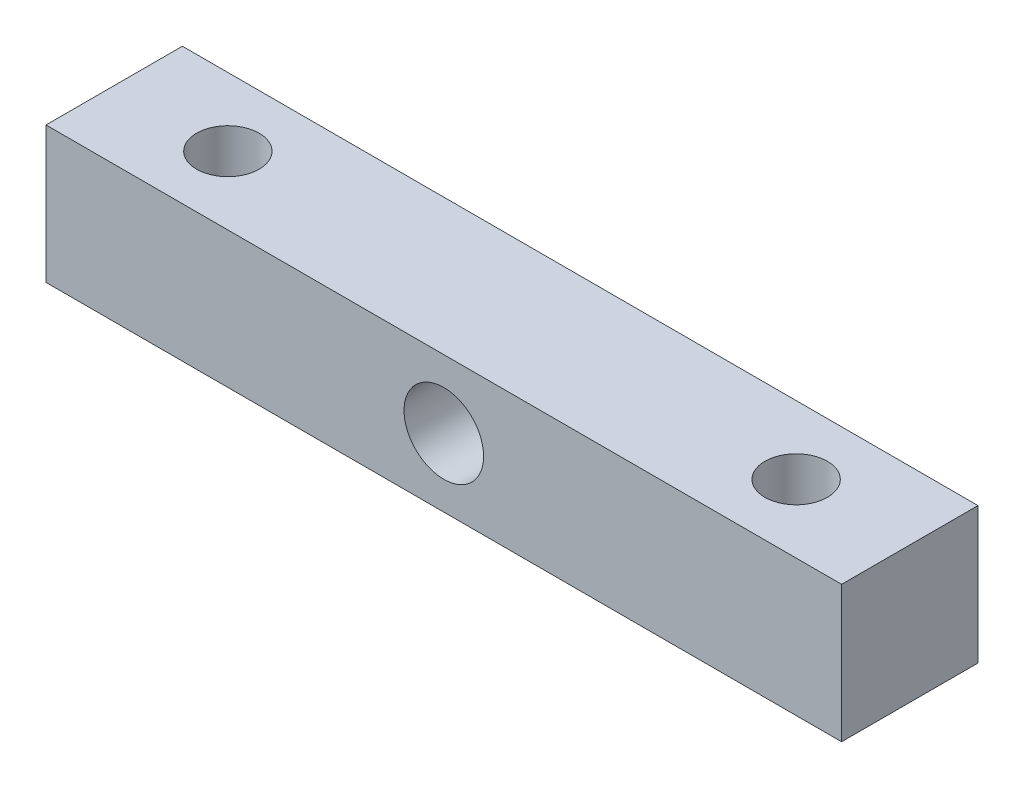
ISO-10303-21;
HEADER;
FILE_DESCRIPTION(('STEP AP214'),'2;1');
FILE_NAME('part.step','',(''),(''),'','','');
FILE_SCHEMA(('AUTOMOTIVE_DESIGN { 1 0 10303 214 1 1 1 1 }'));
ENDSEC;
DATA;
#1=APPLICATION_CONTEXT('core data for automotive mechanical design processes');
#2=APPLICATION_PROTOCOL_DEFINITION('international standard','automotive_design',2000,#1);
#3=PRODUCT_CONTEXT('',#1,'mechanical');
#4=PRODUCT('Part','Part','',(#3));
#5=PRODUCT_RELATED_PRODUCT_CATEGORY('part','',(#4));
#6=PRODUCT_DEFINITION_FORMATION('','',#4);
#7=PRODUCT_DEFINITION_CONTEXT('part definition',#1,'design');
#8=PRODUCT_DEFINITION('design','',#6,#7);
#9=PRODUCT_DEFINITION_SHAPE('','',#8);
#10=(LENGTH_UNIT() NAMED_UNIT(*) SI_UNIT(.MILLI.,.METRE.));
#11=(NAMED_UNIT(*) PLANE_ANGLE_UNIT() SI_UNIT($,.RADIAN.));
#12=(NAMED_UNIT(*) SI_UNIT($,.STERADIAN.) SOLID_ANGLE_UNIT());
#13=UNCERTAINTY_MEASURE_WITH_UNIT(LENGTH_MEASURE(1.E-05),#10,'distance_accuracy_value','');
#14=(GEOMETRIC_REPRESENTATION_CONTEXT(3) GLOBAL_UNCERTAINTY_ASSIGNED_CONTEXT((#13)) GLOBAL_UNIT_ASSIGNED_CONTEXT((#10,
#11,#12)) REPRESENTATION_CONTEXT('',''));
#15=CARTESIAN_POINT('',(0.,0.,0.));
#16=DIRECTION('',(0.,0.,1.));
#17=DIRECTION('',(1.,0.,0.));
#18=AXIS2_PLACEMENT_3D('',#15,#16,#17);
#19=CARTESIAN_POINT('',(0.,12.,0.));
#20=DIRECTION('',(0.,0.,-1.));
#21=DIRECTION('',(-1.,0.,0.));
#22=AXIS2_PLACEMENT_3D('',#19,#20,#21);
#23=PLANE('',#22);
#24=CARTESIAN_POINT('',(35.,6.,0.));
#25=DIRECTION('',(0.,0.,1.));
#26=DIRECTION('',(1.,0.,0.));
#27=AXIS2_PLACEMENT_3D('',#24,#25,#26);
#28=CIRCLE('',#27,3.49999999999999);
#29=CARTESIAN_POINT('',(38.5,6.,0.));
#30=VERTEX_POINT('',#29);
#31=EDGE_CURVE('E114',#30,#30,#28,.T.);
#32=ORIENTED_EDGE('',*,*,#31,.F.);
#33=EDGE_LOOP('',(#32));
#34=FACE_BOUND('',#33,.T.);
#35=DIRECTION('',(1.,0.,0.));
#36=VECTOR('',#35,1.);
#37=CARTESIAN_POINT('',(0.,0.,0.));
#38=LINE('',#37,#36);
#39=CARTESIAN_POINT('',(0.,0.,0.));
#40=VERTEX_POINT('',#39);
#41=CARTESIAN_POINT('',(70.,0.,0.));
#42=VERTEX_POINT('',#41);
#43=EDGE_CURVE('E98',#40,#42,#38,.T.);
#44=ORIENTED_EDGE('',*,*,#43,.T.);
#45=DIRECTION('',(0.,-1.,0.));
#46=VECTOR('',#45,1.);
#47=CARTESIAN_POINT('',(70.,12.,0.));
#48=LINE('',#47,#46);
#49=CARTESIAN_POINT('',(70.,12.,0.));
#50=VERTEX_POINT('',#49);
#51=EDGE_CURVE('E11',#50,#42,#48,.T.);
#52=ORIENTED_EDGE('',*,*,#51,.F.);
#53=DIRECTION('',(1.,0.,0.));
#54=VECTOR('',#53,1.);
#55=CARTESIAN_POINT('',(0.,12.,0.));
#56=LINE('',#55,#54);
#57=CARTESIAN_POINT('',(0.,12.,0.));
#58=VERTEX_POINT('',#57);
#59=EDGE_CURVE('E86',#58,#50,#56,.T.);
#60=ORIENTED_EDGE('',*,*,#59,.F.);
#61=DIRECTION('',(0.,-1.,0.));
#62=VECTOR('',#61,1.);
#63=CARTESIAN_POINT('',(0.,12.,0.));
#64=LINE('',#63,#62);
#65=EDGE_CURVE('E94',#58,#40,#64,.T.);
#66=ORIENTED_EDGE('',*,*,#65,.T.);
#67=EDGE_LOOP('',(#44,#52,#60,#66));
#68=FACE_BOUND('',#67,.T.);
#69=ADVANCED_FACE('F35',(#34,#68),#23,.F.);
#70=CARTESIAN_POINT('',(70.,12.,0.));
#71=DIRECTION('',(-1.,0.,0.));
#72=DIRECTION('',(0.,0.,1.));
#73=AXIS2_PLACEMENT_3D('',#70,#71,#72);
#74=PLANE('',#73);
#75=DIRECTION('',(0.,0.,-1.));
#76=VECTOR('',#75,1.);
#77=CARTESIAN_POINT('',(70.,0.,0.));
#78=LINE('',#77,#76);
#79=CARTESIAN_POINT('',(70.,0.,-12.));
#80=VERTEX_POINT('',#79);
#81=EDGE_CURVE('E90',#42,#80,#78,.T.);
#82=ORIENTED_EDGE('',*,*,#81,.T.);
#83=DIRECTION('',(0.,-1.,0.));
#84=VECTOR('',#83,1.);
#85=CARTESIAN_POINT('',(70.,12.,-12.));
#86=LINE('',#85,#84);
#87=CARTESIAN_POINT('',(70.,12.,-12.));
#88=VERTEX_POINT('',#87);
#89=EDGE_CURVE('E43',#88,#80,#86,.T.);
#90=ORIENTED_EDGE('',*,*,#89,.F.);
#91=DIRECTION('',(0.,0.,-1.));
#92=VECTOR('',#91,1.);
#93=CARTESIAN_POINT('',(70.,12.,0.));
#94=LINE('',#93,#92);
#95=EDGE_CURVE('E81',#50,#88,#94,.T.);
#96=ORIENTED_EDGE('',*,*,#95,.F.);
#97=ORIENTED_EDGE('',*,*,#51,.T.);
#98=EDGE_LOOP('',(#82,#90,#96,#97));
#99=FACE_BOUND('',#98,.T.);
#100=ADVANCED_FACE('F89',(#99),#74,.F.);
#101=CARTESIAN_POINT('',(0.,12.,-12.));
#102=DIRECTION('',(0.,0.,1.));
#103=DIRECTION('',(1.,0.,0.));
#104=AXIS2_PLACEMENT_3D('',#101,#102,#103);
#105=PLANE('',#104);
#106=CARTESIAN_POINT('',(35.,6.,-12.));
#107=DIRECTION('',(0.,0.,1.));
#108=DIRECTION('',(1.,0.,0.));
#109=AXIS2_PLACEMENT_3D('',#106,#107,#108);
#110=CIRCLE('',#109,3.5);
#111=CARTESIAN_POINT('',(38.5,6.,-12.));
#112=VERTEX_POINT('',#111);
#113=EDGE_CURVE('E101',#112,#112,#110,.T.);
#114=ORIENTED_EDGE('',*,*,#113,.T.);
#115=EDGE_LOOP('',(#114));
#116=FACE_BOUND('',#115,.T.);
#117=DIRECTION('',(-1.,0.,0.));
#118=VECTOR('',#117,1.);
#119=CARTESIAN_POINT('',(0.,0.,-12.));
#120=LINE('',#119,#118);
#121=CARTESIAN_POINT('',(0.,0.,-12.));
#122=VERTEX_POINT('',#121);
#123=EDGE_CURVE('E68',#80,#122,#120,.T.);
#124=ORIENTED_EDGE('',*,*,#123,.T.);
#125=DIRECTION('',(0.,-1.,0.));
#126=VECTOR('',#125,1.);
#127=CARTESIAN_POINT('',(0.,12.,-12.));
#128=LINE('',#127,#126);
#129=CARTESIAN_POINT('',(0.,12.,-12.));
#130=VERTEX_POINT('',#129);
#131=EDGE_CURVE('E91',#130,#122,#128,.T.);
#132=ORIENTED_EDGE('',*,*,#131,.F.);
#133=DIRECTION('',(-1.,0.,0.));
#134=VECTOR('',#133,1.);
#135=CARTESIAN_POINT('',(0.,12.,-12.));
#136=LINE('',#135,#134);
#137=EDGE_CURVE('E84',#88,#130,#136,.T.);
#138=ORIENTED_EDGE('',*,*,#137,.F.);
#139=ORIENTED_EDGE('',*,*,#89,.T.);
#140=EDGE_LOOP('',(#124,#132,#138,#139));
#141=FACE_BOUND('',#140,.T.);
#142=ADVANCED_FACE('F92',(#116,#141),#105,.F.);
#143=CARTESIAN_POINT('',(0.,12.,0.));
#144=DIRECTION('',(1.,0.,0.));
#145=DIRECTION('',(0.,0.,-1.));
#146=AXIS2_PLACEMENT_3D('',#143,#144,#145);
#147=PLANE('',#146);
#148=DIRECTION('',(0.,0.,1.));
#149=VECTOR('',#148,1.);
#150=CARTESIAN_POINT('',(0.,0.,0.));
#151=LINE('',#150,#149);
#152=EDGE_CURVE('E74',#122,#40,#151,.T.);
#153=ORIENTED_EDGE('',*,*,#152,.T.);
#154=ORIENTED_EDGE('',*,*,#65,.F.);
#155=DIRECTION('',(0.,0.,1.));
#156=VECTOR('',#155,1.);
#157=CARTESIAN_POINT('',(0.,12.,0.));
#158=LINE('',#157,#156);
#159=EDGE_CURVE('E51',#130,#58,#158,.T.);
#160=ORIENTED_EDGE('',*,*,#159,.F.);
#161=ORIENTED_EDGE('',*,*,#131,.T.);
#162=EDGE_LOOP('',(#153,#154,#160,#161));
#163=FACE_BOUND('',#162,.T.);
#164=ADVANCED_FACE('F106',(#163),#147,.F.);
#165=CARTESIAN_POINT('',(70.,12.,0.));
#166=DIRECTION('',(0.,1.,0.));
#167=DIRECTION('',(0.,0.,1.));
#168=AXIS2_PLACEMENT_3D('',#165,#166,#167);
#169=PLANE('',#168);
#170=CARTESIAN_POINT('',(10.,12.,-6.));
#171=DIRECTION('',(0.,1.,0.));
#172=DIRECTION('',(0.,0.,1.));
#173=AXIS2_PLACEMENT_3D('',#170,#171,#172);
#174=CIRCLE('',#173,2.74999999999999);
#175=CARTESIAN_POINT('',(10.,12.,-3.25000000000002));
#176=VERTEX_POINT('',#175);
#177=EDGE_CURVE('E126',#176,#176,#174,.T.);
#178=ORIENTED_EDGE('',*,*,#177,.F.);
#179=EDGE_LOOP('',(#178));
#180=FACE_BOUND('',#179,.T.);
#181=CARTESIAN_POINT('',(60.,12.,-6.));
#182=DIRECTION('',(0.,1.,0.));
#183=DIRECTION('',(0.,0.,1.));
#184=AXIS2_PLACEMENT_3D('',#181,#182,#183);
#185=CIRCLE('',#184,2.75);
#186=CARTESIAN_POINT('',(60.,12.,-3.25000000000001));
#187=VERTEX_POINT('',#186);
#188=EDGE_CURVE('E120',#187,#187,#185,.T.);
#189=ORIENTED_EDGE('',*,*,#188,.F.);
#190=EDGE_LOOP('',(#189));
#191=FACE_BOUND('',#190,.T.);
#192=ORIENTED_EDGE('',*,*,#59,.T.);
#193=ORIENTED_EDGE('',*,*,#95,.T.);
#194=ORIENTED_EDGE('',*,*,#137,.T.);
#195=ORIENTED_EDGE('',*,*,#159,.T.);
#196=EDGE_LOOP('',(#192,#193,#194,#195));
#197=FACE_BOUND('',#196,.T.);
#198=ADVANCED_FACE('F82',(#180,#191,#197),#169,.T.);
#199=CARTESIAN_POINT('',(70.,0.,0.));
#200=DIRECTION('',(0.,1.,0.));
#201=DIRECTION('',(0.,0.,1.));
#202=AXIS2_PLACEMENT_3D('',#199,#200,#201);
#203=PLANE('',#202);
#204=CARTESIAN_POINT('',(10.,0.,-6.));
#205=DIRECTION('',(0.,1.,0.));
#206=DIRECTION('',(0.,0.,1.));
#207=AXIS2_PLACEMENT_3D('',#204,#205,#206);
#208=CIRCLE('',#207,2.75);
#209=CARTESIAN_POINT('',(10.,0.,-3.25000000000001));
#210=VERTEX_POINT('',#209);
#211=EDGE_CURVE('E123',#210,#210,#208,.T.);
#212=ORIENTED_EDGE('',*,*,#211,.T.);
#213=EDGE_LOOP('',(#212));
#214=FACE_BOUND('',#213,.T.);
#215=CARTESIAN_POINT('',(60.,0.,-6.));
#216=DIRECTION('',(0.,1.,0.));
#217=DIRECTION('',(0.,0.,1.));
#218=AXIS2_PLACEMENT_3D('',#215,#216,#217);
#219=CIRCLE('',#218,2.75);
#220=CARTESIAN_POINT('',(60.,0.,-3.25000000000001));
#221=VERTEX_POINT('',#220);
#222=EDGE_CURVE('E117',#221,#221,#219,.T.);
#223=ORIENTED_EDGE('',*,*,#222,.T.);
#224=EDGE_LOOP('',(#223));
#225=FACE_BOUND('',#224,.T.);
#226=ORIENTED_EDGE('',*,*,#43,.F.);
#227=ORIENTED_EDGE('',*,*,#152,.F.);
#228=ORIENTED_EDGE('',*,*,#123,.F.);
#229=ORIENTED_EDGE('',*,*,#81,.F.);
#230=EDGE_LOOP('',(#226,#227,#228,#229));
#231=FACE_BOUND('',#230,.T.);
#232=ADVANCED_FACE('F109',(#214,#225,#231),#203,.F.);
#233=CARTESIAN_POINT('',(35.,6.,0.));
#234=DIRECTION('',(0.,0.,1.));
#235=DIRECTION('',(1.,0.,0.));
#236=AXIS2_PLACEMENT_3D('',#233,#234,#235);
#237=CYLINDRICAL_SURFACE('',#236,3.49999999999999);
#238=ORIENTED_EDGE('',*,*,#113,.F.);
#239=EDGE_LOOP('',(#238));
#240=FACE_BOUND('',#239,.T.);
#241=ORIENTED_EDGE('',*,*,#31,.T.);
#242=EDGE_LOOP('',(#241));
#243=FACE_BOUND('',#242,.T.);
#244=ADVANCED_FACE('F139',(#240,#243),#237,.F.);
#245=CARTESIAN_POINT('',(60.,12.,-6.));
#246=DIRECTION('',(0.,1.,0.));
#247=DIRECTION('',(0.,0.,1.));
#248=AXIS2_PLACEMENT_3D('',#245,#246,#247);
#249=CYLINDRICAL_SURFACE('',#248,2.75);
#250=ORIENTED_EDGE('',*,*,#222,.F.);
#251=EDGE_LOOP('',(#250));
#252=FACE_BOUND('',#251,.T.);
#253=ORIENTED_EDGE('',*,*,#188,.T.);
#254=EDGE_LOOP('',(#253));
#255=FACE_BOUND('',#254,.T.);
#256=ADVANCED_FACE('F137',(#252,#255),#249,.F.);
#257=CARTESIAN_POINT('',(10.,12.,-6.));
#258=DIRECTION('',(0.,1.,0.));
#259=DIRECTION('',(0.,0.,1.));
#260=AXIS2_PLACEMENT_3D('',#257,#258,#259);
#261=CYLINDRICAL_SURFACE('',#260,2.74999999999999);
#262=ORIENTED_EDGE('',*,*,#211,.F.);
#263=EDGE_LOOP('',(#262));
#264=FACE_BOUND('',#263,.T.);
#265=ORIENTED_EDGE('',*,*,#177,.T.);
#266=EDGE_LOOP('',(#265));
#267=FACE_BOUND('',#266,.T.);
#268=ADVANCED_FACE('F130',(#264,#267),#261,.F.);
#269=CLOSED_SHELL('',(#69,#100,#142,#164,#198,#232,#244,#256,#268));
#270=MANIFOLD_SOLID_BREP('B2',#269);
#271=ADVANCED_BREP_SHAPE_REPRESENTATION('',(#18,#270),#14);
#272=SHAPE_DEFINITION_REPRESENTATION(#9,#271);
ENDSEC;
END-ISO-10303-21;
